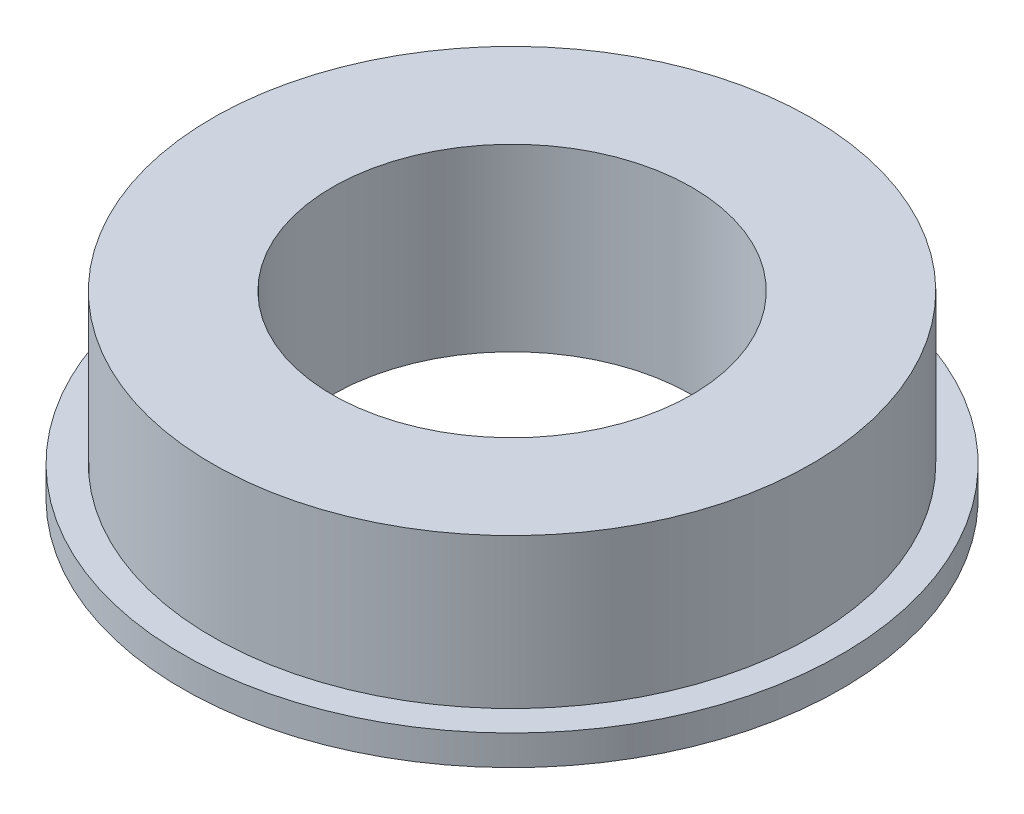
ISO-10303-21;
HEADER;
FILE_DESCRIPTION(('STEP AP214'),'2;1');
FILE_NAME('part.step','',(''),(''),'','','');
FILE_SCHEMA(('AUTOMOTIVE_DESIGN { 1 0 10303 214 1 1 1 1 }'));
ENDSEC;
DATA;
#1=APPLICATION_CONTEXT('core data for automotive mechanical design processes');
#2=APPLICATION_PROTOCOL_DEFINITION('international standard','automotive_design',2000,#1);
#3=PRODUCT_CONTEXT('',#1,'mechanical');
#4=PRODUCT('Part','Part','',(#3));
#5=PRODUCT_RELATED_PRODUCT_CATEGORY('part','',(#4));
#6=PRODUCT_DEFINITION_FORMATION('','',#4);
#7=PRODUCT_DEFINITION_CONTEXT('part definition',#1,'design');
#8=PRODUCT_DEFINITION('design','',#6,#7);
#9=PRODUCT_DEFINITION_SHAPE('','',#8);
#10=(LENGTH_UNIT() NAMED_UNIT(*) SI_UNIT(.MILLI.,.METRE.));
#11=(NAMED_UNIT(*) PLANE_ANGLE_UNIT() SI_UNIT($,.RADIAN.));
#12=(NAMED_UNIT(*) SI_UNIT($,.STERADIAN.) SOLID_ANGLE_UNIT());
#13=UNCERTAINTY_MEASURE_WITH_UNIT(LENGTH_MEASURE(1.E-05),#10,'distance_accuracy_value','');
#14=(GEOMETRIC_REPRESENTATION_CONTEXT(3) GLOBAL_UNCERTAINTY_ASSIGNED_CONTEXT((#13)) GLOBAL_UNIT_ASSIGNED_CONTEXT((#10,
#11,#12)) REPRESENTATION_CONTEXT('',''));
#15=CARTESIAN_POINT('',(0.,0.,0.));
#16=DIRECTION('',(0.,0.,1.));
#17=DIRECTION('',(1.,0.,0.));
#18=AXIS2_PLACEMENT_3D('',#15,#16,#17);
#19=CARTESIAN_POINT('',(0.,0.,0.));
#20=DIRECTION('',(0.,-1.,0.));
#21=DIRECTION('',(0.,0.,-1.));
#22=AXIS2_PLACEMENT_3D('',#19,#20,#21);
#23=CYLINDRICAL_SURFACE('',#22,5.);
#24=CARTESIAN_POINT('',(0.,0.5,0.));
#25=DIRECTION('',(0.,-1.,0.));
#26=DIRECTION('',(0.,0.,-1.));
#27=AXIS2_PLACEMENT_3D('',#24,#25,#26);
#28=CIRCLE('',#27,5.);
#29=CARTESIAN_POINT('',(0.,0.5,-5.));
#30=VERTEX_POINT('',#29);
#31=EDGE_CURVE('E58',#30,#30,#28,.T.);
#32=ORIENTED_EDGE('',*,*,#31,.F.);
#33=EDGE_LOOP('',(#32));
#34=FACE_BOUND('',#33,.T.);
#35=CARTESIAN_POINT('',(0.,3.,0.));
#36=DIRECTION('',(0.,-1.,0.));
#37=DIRECTION('',(0.,0.,-1.));
#38=AXIS2_PLACEMENT_3D('',#35,#36,#37);
#39=CIRCLE('',#38,5.);
#40=CARTESIAN_POINT('',(0.,3.,-5.));
#41=VERTEX_POINT('',#40);
#42=EDGE_CURVE('E10',#41,#41,#39,.T.);
#43=ORIENTED_EDGE('',*,*,#42,.T.);
#44=EDGE_LOOP('',(#43));
#45=FACE_BOUND('',#44,.T.);
#46=ADVANCED_FACE('F36',(#34,#45),#23,.T.);
#47=CARTESIAN_POINT('',(0.,3.,0.));
#48=DIRECTION('',(0.,-1.,0.));
#49=DIRECTION('',(0.,0.,-1.));
#50=AXIS2_PLACEMENT_3D('',#47,#48,#49);
#51=PLANE('',#50);
#52=ORIENTED_EDGE('',*,*,#42,.F.);
#53=EDGE_LOOP('',(#52));
#54=FACE_BOUND('',#53,.T.);
#55=CARTESIAN_POINT('',(0.,3.,0.));
#56=DIRECTION('',(0.,-1.,0.));
#57=DIRECTION('',(0.,0.,-1.));
#58=AXIS2_PLACEMENT_3D('',#55,#56,#57);
#59=CIRCLE('',#58,3.);
#60=CARTESIAN_POINT('',(0.,3.,-3.));
#61=VERTEX_POINT('',#60);
#62=EDGE_CURVE('E42',#61,#61,#59,.T.);
#63=ORIENTED_EDGE('',*,*,#62,.T.);
#64=EDGE_LOOP('',(#63));
#65=FACE_BOUND('',#64,.T.);
#66=ADVANCED_FACE('F65',(#54,#65),#51,.F.);
#67=CARTESIAN_POINT('',(0.,0.,0.));
#68=DIRECTION('',(0.,-1.,0.));
#69=DIRECTION('',(0.,0.,-1.));
#70=AXIS2_PLACEMENT_3D('',#67,#68,#69);
#71=CYLINDRICAL_SURFACE('',#70,3.);
#72=CARTESIAN_POINT('',(0.,0.,0.));
#73=DIRECTION('',(0.,-1.,0.));
#74=DIRECTION('',(0.,0.,-1.));
#75=AXIS2_PLACEMENT_3D('',#72,#73,#74);
#76=CIRCLE('',#75,3.);
#77=CARTESIAN_POINT('',(0.,0.,-3.));
#78=VERTEX_POINT('',#77);
#79=EDGE_CURVE('E46',#78,#78,#76,.T.);
#80=ORIENTED_EDGE('',*,*,#79,.T.);
#81=EDGE_LOOP('',(#80));
#82=FACE_BOUND('',#81,.T.);
#83=ORIENTED_EDGE('',*,*,#62,.F.);
#84=EDGE_LOOP('',(#83));
#85=FACE_BOUND('',#84,.T.);
#86=ADVANCED_FACE('F69',(#82,#85),#71,.F.);
#87=CARTESIAN_POINT('',(0.,0.,0.));
#88=DIRECTION('',(0.,-1.,0.));
#89=DIRECTION('',(0.,0.,-1.));
#90=AXIS2_PLACEMENT_3D('',#87,#88,#89);
#91=PLANE('',#90);
#92=CARTESIAN_POINT('',(0.,0.,0.));
#93=DIRECTION('',(0.,-1.,0.));
#94=DIRECTION('',(0.,0.,-1.));
#95=AXIS2_PLACEMENT_3D('',#92,#93,#94);
#96=CIRCLE('',#95,5.5);
#97=CARTESIAN_POINT('',(0.,0.,-5.5));
#98=VERTEX_POINT('',#97);
#99=EDGE_CURVE('E50',#98,#98,#96,.T.);
#100=ORIENTED_EDGE('',*,*,#99,.T.);
#101=EDGE_LOOP('',(#100));
#102=FACE_BOUND('',#101,.T.);
#103=ORIENTED_EDGE('',*,*,#79,.F.);
#104=EDGE_LOOP('',(#103));
#105=FACE_BOUND('',#104,.T.);
#106=ADVANCED_FACE('F74',(#102,#105),#91,.T.);
#107=CARTESIAN_POINT('',(0.,0.,0.));
#108=DIRECTION('',(0.,-1.,0.));
#109=DIRECTION('',(0.,0.,-1.));
#110=AXIS2_PLACEMENT_3D('',#107,#108,#109);
#111=CYLINDRICAL_SURFACE('',#110,5.5);
#112=CARTESIAN_POINT('',(0.,0.5,0.));
#113=DIRECTION('',(0.,-1.,0.));
#114=DIRECTION('',(0.,0.,-1.));
#115=AXIS2_PLACEMENT_3D('',#112,#113,#114);
#116=CIRCLE('',#115,5.5);
#117=CARTESIAN_POINT('',(0.,0.5,-5.5));
#118=VERTEX_POINT('',#117);
#119=EDGE_CURVE('E55',#118,#118,#116,.T.);
#120=ORIENTED_EDGE('',*,*,#119,.T.);
#121=EDGE_LOOP('',(#120));
#122=FACE_BOUND('',#121,.T.);
#123=ORIENTED_EDGE('',*,*,#99,.F.);
#124=EDGE_LOOP('',(#123));
#125=FACE_BOUND('',#124,.T.);
#126=ADVANCED_FACE('F80',(#122,#125),#111,.T.);
#127=CARTESIAN_POINT('',(0.,0.5,0.));
#128=DIRECTION('',(0.,-1.,0.));
#129=DIRECTION('',(0.,0.,-1.));
#130=AXIS2_PLACEMENT_3D('',#127,#128,#129);
#131=PLANE('',#130);
#132=ORIENTED_EDGE('',*,*,#119,.F.);
#133=EDGE_LOOP('',(#132));
#134=FACE_BOUND('',#133,.T.);
#135=ORIENTED_EDGE('',*,*,#31,.T.);
#136=EDGE_LOOP('',(#135));
#137=FACE_BOUND('',#136,.T.);
#138=ADVANCED_FACE('F62',(#134,#137),#131,.F.);
#139=CLOSED_SHELL('',(#46,#66,#86,#106,#126,#138));
#140=MANIFOLD_SOLID_BREP('B2',#139);
#141=ADVANCED_BREP_SHAPE_REPRESENTATION('',(#18,#140),#14);
#142=SHAPE_DEFINITION_REPRESENTATION(#9,#141);
ENDSEC;
END-ISO-10303-21;
